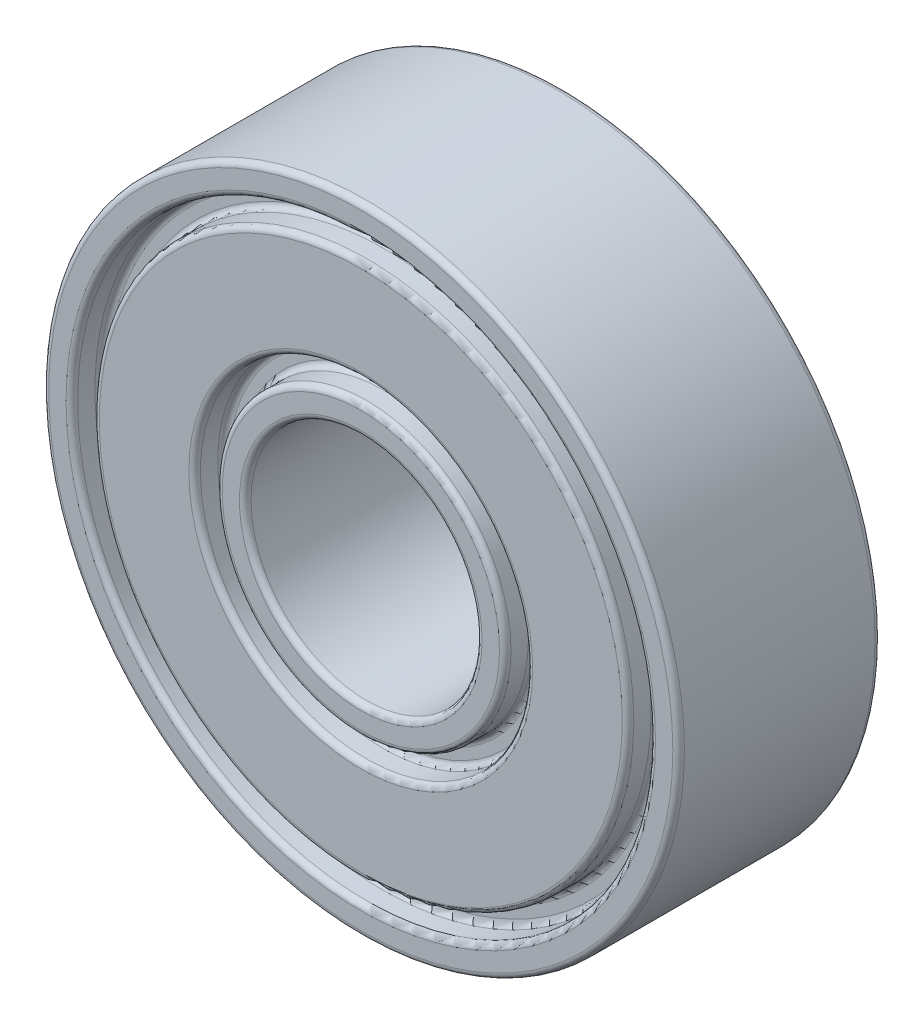
ISO-10303-21;
HEADER;
FILE_DESCRIPTION(('STEP AP214'),'2;1');
FILE_NAME('part.step','',(''),(''),'','','');
FILE_SCHEMA(('AUTOMOTIVE_DESIGN { 1 0 10303 214 1 1 1 1 }'));
ENDSEC;
DATA;
#1=APPLICATION_CONTEXT('core data for automotive mechanical design processes');
#2=APPLICATION_PROTOCOL_DEFINITION('international standard','automotive_design',2000,#1);
#3=PRODUCT_CONTEXT('',#1,'mechanical');
#4=PRODUCT('Part','Part','',(#3));
#5=PRODUCT_RELATED_PRODUCT_CATEGORY('part','',(#4));
#6=PRODUCT_DEFINITION_FORMATION('','',#4);
#7=PRODUCT_DEFINITION_CONTEXT('part definition',#1,'design');
#8=PRODUCT_DEFINITION('design','',#6,#7);
#9=PRODUCT_DEFINITION_SHAPE('','',#8);
#10=(LENGTH_UNIT() NAMED_UNIT(*) SI_UNIT(.MILLI.,.METRE.));
#11=(NAMED_UNIT(*) PLANE_ANGLE_UNIT() SI_UNIT($,.RADIAN.));
#12=(NAMED_UNIT(*) SI_UNIT($,.STERADIAN.) SOLID_ANGLE_UNIT());
#13=UNCERTAINTY_MEASURE_WITH_UNIT(LENGTH_MEASURE(1.E-05),#10,'distance_accuracy_value','');
#14=(GEOMETRIC_REPRESENTATION_CONTEXT(3) GLOBAL_UNCERTAINTY_ASSIGNED_CONTEXT((#13)) GLOBAL_UNIT_ASSIGNED_CONTEXT((#10,
#11,#12)) REPRESENTATION_CONTEXT('',''));
#15=CARTESIAN_POINT('',(0.,0.,0.));
#16=DIRECTION('',(0.,0.,1.));
#17=DIRECTION('',(1.,0.,0.));
#18=AXIS2_PLACEMENT_3D('',#15,#16,#17);
#19=CARTESIAN_POINT('',(0.,0.,7.));
#20=DIRECTION('',(0.,0.,1.));
#21=DIRECTION('',(1.,0.,0.));
#22=AXIS2_PLACEMENT_3D('',#19,#20,#21);
#23=PLANE('',#22);
#24=CARTESIAN_POINT('',(0.,0.,7.));
#25=DIRECTION('',(0.,0.,1.));
#26=DIRECTION('',(1.,0.,0.));
#27=AXIS2_PLACEMENT_3D('',#24,#25,#26);
#28=CIRCLE('',#27,4.8);
#29=CARTESIAN_POINT('',(4.8,0.,7.));
#30=VERTEX_POINT('',#29);
#31=EDGE_CURVE('E157',#30,#30,#28,.T.);
#32=ORIENTED_EDGE('',*,*,#31,.T.);
#33=EDGE_LOOP('',(#32));
#34=FACE_BOUND('',#33,.T.);
#35=CARTESIAN_POINT('',(0.,0.,7.));
#36=DIRECTION('',(0.,0.,1.));
#37=DIRECTION('',(1.,0.,0.));
#38=AXIS2_PLACEMENT_3D('',#35,#36,#37);
#39=CIRCLE('',#38,4.2);
#40=CARTESIAN_POINT('',(4.2,0.,7.));
#41=VERTEX_POINT('',#40);
#42=EDGE_CURVE('E161',#41,#41,#39,.F.);
#43=ORIENTED_EDGE('',*,*,#42,.T.);
#44=EDGE_LOOP('',(#43));
#45=FACE_BOUND('',#44,.T.);
#46=ADVANCED_FACE('F85',(#34,#45),#23,.T.);
#47=CARTESIAN_POINT('',(0.,0.,0.));
#48=DIRECTION('',(0.,0.,1.));
#49=DIRECTION('',(1.,0.,0.));
#50=AXIS2_PLACEMENT_3D('',#47,#48,#49);
#51=PLANE('',#50);
#52=CARTESIAN_POINT('',(0.,0.,0.));
#53=DIRECTION('',(0.,0.,1.));
#54=DIRECTION('',(1.,0.,0.));
#55=AXIS2_PLACEMENT_3D('',#52,#53,#54);
#56=CIRCLE('',#55,4.8);
#57=CARTESIAN_POINT('',(4.8,0.,0.));
#58=VERTEX_POINT('',#57);
#59=EDGE_CURVE('E173',#58,#58,#56,.F.);
#60=ORIENTED_EDGE('',*,*,#59,.T.);
#61=EDGE_LOOP('',(#60));
#62=FACE_BOUND('',#61,.T.);
#63=CARTESIAN_POINT('',(0.,0.,0.));
#64=DIRECTION('',(0.,0.,1.));
#65=DIRECTION('',(1.,0.,0.));
#66=AXIS2_PLACEMENT_3D('',#63,#64,#65);
#67=CIRCLE('',#66,4.2);
#68=CARTESIAN_POINT('',(4.2,0.,0.));
#69=VERTEX_POINT('',#68);
#70=EDGE_CURVE('E177',#69,#69,#67,.T.);
#71=ORIENTED_EDGE('',*,*,#70,.T.);
#72=EDGE_LOOP('',(#71));
#73=FACE_BOUND('',#72,.T.);
#74=ADVANCED_FACE('F322',(#62,#73),#51,.F.);
#75=CARTESIAN_POINT('',(0.,0.,7.));
#76=DIRECTION('',(0.,0.,-1.));
#77=DIRECTION('',(-1.,0.,0.));
#78=AXIS2_PLACEMENT_3D('',#75,#76,#77);
#79=CYLINDRICAL_SURFACE('',#78,11.);
#80=CARTESIAN_POINT('',(0.,0.,0.2));
#81=DIRECTION('',(0.,0.,1.));
#82=DIRECTION('',(1.,0.,0.));
#83=AXIS2_PLACEMENT_3D('',#80,#81,#82);
#84=CIRCLE('',#83,11.);
#85=CARTESIAN_POINT('',(11.,0.,0.2));
#86=VERTEX_POINT('',#85);
#87=EDGE_CURVE('E245',#86,#86,#84,.T.);
#88=ORIENTED_EDGE('',*,*,#87,.T.);
#89=EDGE_LOOP('',(#88));
#90=FACE_BOUND('',#89,.T.);
#91=CARTESIAN_POINT('',(0.,0.,6.8));
#92=DIRECTION('',(0.,0.,1.));
#93=DIRECTION('',(1.,0.,0.));
#94=AXIS2_PLACEMENT_3D('',#91,#92,#93);
#95=CIRCLE('',#94,11.);
#96=CARTESIAN_POINT('',(11.,0.,6.8));
#97=VERTEX_POINT('',#96);
#98=EDGE_CURVE('E249',#97,#97,#95,.F.);
#99=ORIENTED_EDGE('',*,*,#98,.T.);
#100=EDGE_LOOP('',(#99));
#101=FACE_BOUND('',#100,.T.);
#102=ADVANCED_FACE('F254',(#90,#101),#79,.T.);
#103=CARTESIAN_POINT('',(0.,0.,7.));
#104=DIRECTION('',(0.,0.,1.));
#105=DIRECTION('',(1.,0.,0.));
#106=AXIS2_PLACEMENT_3D('',#103,#104,#105);
#107=CIRCLE('',#106,10.8);
#108=CARTESIAN_POINT('',(10.8,0.,7.));
#109=VERTEX_POINT('',#108);
#110=EDGE_CURVE('E141',#109,#109,#107,.T.);
#111=ORIENTED_EDGE('',*,*,#110,.T.);
#112=EDGE_LOOP('',(#111));
#113=FACE_BOUND('',#112,.T.);
#114=CARTESIAN_POINT('',(0.,0.,7.));
#115=DIRECTION('',(0.,0.,1.));
#116=DIRECTION('',(1.,0.,0.));
#117=AXIS2_PLACEMENT_3D('',#114,#115,#116);
#118=CIRCLE('',#117,10.2);
#119=CARTESIAN_POINT('',(10.2,0.,7.));
#120=VERTEX_POINT('',#119);
#121=EDGE_CURVE('E145',#120,#120,#118,.F.);
#122=ORIENTED_EDGE('',*,*,#121,.T.);
#123=EDGE_LOOP('',(#122));
#124=FACE_BOUND('',#123,.T.);
#125=ADVANCED_FACE('F264',(#113,#124),#23,.T.);
#126=CARTESIAN_POINT('',(0.,0.,0.));
#127=DIRECTION('',(0.,0.,1.));
#128=DIRECTION('',(1.,0.,0.));
#129=AXIS2_PLACEMENT_3D('',#126,#127,#128);
#130=CIRCLE('',#129,10.8);
#131=CARTESIAN_POINT('',(10.8,0.,0.));
#132=VERTEX_POINT('',#131);
#133=EDGE_CURVE('E237',#132,#132,#130,.F.);
#134=ORIENTED_EDGE('',*,*,#133,.T.);
#135=EDGE_LOOP('',(#134));
#136=FACE_BOUND('',#135,.T.);
#137=CARTESIAN_POINT('',(0.,0.,0.));
#138=DIRECTION('',(0.,0.,1.));
#139=DIRECTION('',(1.,0.,0.));
#140=AXIS2_PLACEMENT_3D('',#137,#138,#139);
#141=CIRCLE('',#140,10.2);
#142=CARTESIAN_POINT('',(10.2,0.,0.));
#143=VERTEX_POINT('',#142);
#144=EDGE_CURVE('E241',#143,#143,#141,.T.);
#145=ORIENTED_EDGE('',*,*,#144,.T.);
#146=EDGE_LOOP('',(#145));
#147=FACE_BOUND('',#146,.T.);
#148=ADVANCED_FACE('F267',(#136,#147),#51,.F.);
#149=CARTESIAN_POINT('',(0.,0.,7.));
#150=DIRECTION('',(0.,0.,-1.));
#151=DIRECTION('',(-1.,0.,0.));
#152=AXIS2_PLACEMENT_3D('',#149,#150,#151);
#153=CYLINDRICAL_SURFACE('',#152,4.);
#154=CARTESIAN_POINT('',(0.,0.,0.2));
#155=DIRECTION('',(0.,0.,1.));
#156=DIRECTION('',(1.,0.,0.));
#157=AXIS2_PLACEMENT_3D('',#154,#155,#156);
#158=CIRCLE('',#157,4.);
#159=CARTESIAN_POINT('',(4.,0.,0.2));
#160=VERTEX_POINT('',#159);
#161=EDGE_CURVE('E165',#160,#160,#158,.F.);
#162=ORIENTED_EDGE('',*,*,#161,.T.);
#163=EDGE_LOOP('',(#162));
#164=FACE_BOUND('',#163,.T.);
#165=CARTESIAN_POINT('',(0.,0.,6.8));
#166=DIRECTION('',(0.,0.,1.));
#167=DIRECTION('',(1.,0.,0.));
#168=AXIS2_PLACEMENT_3D('',#165,#166,#167);
#169=CIRCLE('',#168,4.);
#170=CARTESIAN_POINT('',(4.,0.,6.8));
#171=VERTEX_POINT('',#170);
#172=EDGE_CURVE('E169',#171,#171,#169,.T.);
#173=ORIENTED_EDGE('',*,*,#172,.T.);
#174=EDGE_LOOP('',(#173));
#175=FACE_BOUND('',#174,.T.);
#176=ADVANCED_FACE('F377',(#164,#175),#153,.F.);
#177=CARTESIAN_POINT('',(0.,0.,1.));
#178=DIRECTION('',(0.,0.,-1.));
#179=DIRECTION('',(-1.,0.,0.));
#180=AXIS2_PLACEMENT_3D('',#177,#178,#179);
#181=CYLINDRICAL_SURFACE('',#180,5.);
#182=CARTESIAN_POINT('',(0.,0.,0.8));
#183=DIRECTION('',(0.,0.,1.));
#184=DIRECTION('',(1.,0.,0.));
#185=AXIS2_PLACEMENT_3D('',#182,#183,#184);
#186=CIRCLE('',#185,5.);
#187=CARTESIAN_POINT('',(5.,0.,0.8));
#188=VERTEX_POINT('',#187);
#189=EDGE_CURVE('E181',#188,#188,#186,.F.);
#190=ORIENTED_EDGE('',*,*,#189,.T.);
#191=EDGE_LOOP('',(#190));
#192=FACE_BOUND('',#191,.T.);
#193=CARTESIAN_POINT('',(0.,0.,0.2));
#194=DIRECTION('',(0.,0.,1.));
#195=DIRECTION('',(1.,0.,0.));
#196=AXIS2_PLACEMENT_3D('',#193,#194,#195);
#197=CIRCLE('',#196,5.);
#198=CARTESIAN_POINT('',(5.,0.,0.2));
#199=VERTEX_POINT('',#198);
#200=EDGE_CURVE('E185',#199,#199,#197,.T.);
#201=ORIENTED_EDGE('',*,*,#200,.T.);
#202=EDGE_LOOP('',(#201));
#203=FACE_BOUND('',#202,.T.);
#204=ADVANCED_FACE('F374',(#192,#203),#181,.T.);
#205=CARTESIAN_POINT('',(0.,0.,1.));
#206=DIRECTION('',(0.,0.,-1.));
#207=DIRECTION('',(-1.,0.,0.));
#208=AXIS2_PLACEMENT_3D('',#205,#206,#207);
#209=CYLINDRICAL_SURFACE('',#208,5.75);
#210=CARTESIAN_POINT('',(0.,0.,0.2));
#211=DIRECTION('',(0.,0.,1.));
#212=DIRECTION('',(1.,0.,0.));
#213=AXIS2_PLACEMENT_3D('',#210,#211,#212);
#214=CIRCLE('',#213,5.75);
#215=CARTESIAN_POINT('',(5.75,0.,0.2));
#216=VERTEX_POINT('',#215);
#217=EDGE_CURVE('E197',#216,#216,#214,.F.);
#218=ORIENTED_EDGE('',*,*,#217,.T.);
#219=EDGE_LOOP('',(#218));
#220=FACE_BOUND('',#219,.T.);
#221=CARTESIAN_POINT('',(0.,0.,0.8));
#222=DIRECTION('',(0.,0.,1.));
#223=DIRECTION('',(1.,0.,0.));
#224=AXIS2_PLACEMENT_3D('',#221,#222,#223);
#225=CIRCLE('',#224,5.75);
#226=CARTESIAN_POINT('',(5.75,0.,0.8));
#227=VERTEX_POINT('',#226);
#228=EDGE_CURVE('E201',#227,#227,#225,.T.);
#229=ORIENTED_EDGE('',*,*,#228,.T.);
#230=EDGE_LOOP('',(#229));
#231=FACE_BOUND('',#230,.T.);
#232=ADVANCED_FACE('F370',(#220,#231),#209,.F.);
#233=CARTESIAN_POINT('',(0.,0.,1.));
#234=DIRECTION('',(0.,0.,1.));
#235=DIRECTION('',(1.,0.,0.));
#236=AXIS2_PLACEMENT_3D('',#233,#234,#235);
#237=PLANE('',#236);
#238=CARTESIAN_POINT('',(0.,0.,1.));
#239=DIRECTION('',(0.,0.,1.));
#240=DIRECTION('',(1.,0.,0.));
#241=AXIS2_PLACEMENT_3D('',#238,#239,#240);
#242=CIRCLE('',#241,5.55);
#243=CARTESIAN_POINT('',(5.55,0.,1.));
#244=VERTEX_POINT('',#243);
#245=EDGE_CURVE('E189',#244,#244,#242,.F.);
#246=ORIENTED_EDGE('',*,*,#245,.T.);
#247=EDGE_LOOP('',(#246));
#248=FACE_BOUND('',#247,.T.);
#249=CARTESIAN_POINT('',(0.,0.,1.));
#250=DIRECTION('',(0.,0.,1.));
#251=DIRECTION('',(1.,0.,0.));
#252=AXIS2_PLACEMENT_3D('',#249,#250,#251);
#253=CIRCLE('',#252,5.2);
#254=CARTESIAN_POINT('',(5.2,0.,1.));
#255=VERTEX_POINT('',#254);
#256=EDGE_CURVE('E193',#255,#255,#253,.T.);
#257=ORIENTED_EDGE('',*,*,#256,.T.);
#258=EDGE_LOOP('',(#257));
#259=FACE_BOUND('',#258,.T.);
#260=ADVANCED_FACE('F366',(#248,#259),#237,.F.);
#261=CARTESIAN_POINT('',(0.,0.,1.));
#262=DIRECTION('',(0.,0.,-1.));
#263=DIRECTION('',(-1.,0.,0.));
#264=AXIS2_PLACEMENT_3D('',#261,#262,#263);
#265=CYLINDRICAL_SURFACE('',#264,9.25);
#266=CARTESIAN_POINT('',(0.,0.,0.8));
#267=DIRECTION('',(0.,0.,1.));
#268=DIRECTION('',(1.,0.,0.));
#269=AXIS2_PLACEMENT_3D('',#266,#267,#268);
#270=CIRCLE('',#269,9.25);
#271=CARTESIAN_POINT('',(9.25,0.,0.8));
#272=VERTEX_POINT('',#271);
#273=EDGE_CURVE('E213',#272,#272,#270,.F.);
#274=ORIENTED_EDGE('',*,*,#273,.T.);
#275=EDGE_LOOP('',(#274));
#276=FACE_BOUND('',#275,.T.);
#277=CARTESIAN_POINT('',(0.,0.,0.2));
#278=DIRECTION('',(0.,0.,1.));
#279=DIRECTION('',(1.,0.,0.));
#280=AXIS2_PLACEMENT_3D('',#277,#278,#279);
#281=CIRCLE('',#280,9.25);
#282=CARTESIAN_POINT('',(9.25,0.,0.2));
#283=VERTEX_POINT('',#282);
#284=EDGE_CURVE('E217',#283,#283,#281,.T.);
#285=ORIENTED_EDGE('',*,*,#284,.T.);
#286=EDGE_LOOP('',(#285));
#287=FACE_BOUND('',#286,.T.);
#288=ADVANCED_FACE('F362',(#276,#287),#265,.T.);
#289=CARTESIAN_POINT('',(0.,0.,1.));
#290=DIRECTION('',(0.,0.,-1.));
#291=DIRECTION('',(-1.,0.,0.));
#292=AXIS2_PLACEMENT_3D('',#289,#290,#291);
#293=CYLINDRICAL_SURFACE('',#292,10.);
#294=CARTESIAN_POINT('',(0.,0.,0.2));
#295=DIRECTION('',(0.,0.,1.));
#296=DIRECTION('',(1.,0.,0.));
#297=AXIS2_PLACEMENT_3D('',#294,#295,#296);
#298=CIRCLE('',#297,10.);
#299=CARTESIAN_POINT('',(10.,0.,0.2));
#300=VERTEX_POINT('',#299);
#301=EDGE_CURVE('E229',#300,#300,#298,.F.);
#302=ORIENTED_EDGE('',*,*,#301,.T.);
#303=EDGE_LOOP('',(#302));
#304=FACE_BOUND('',#303,.T.);
#305=CARTESIAN_POINT('',(0.,0.,0.8));
#306=DIRECTION('',(0.,0.,1.));
#307=DIRECTION('',(1.,0.,0.));
#308=AXIS2_PLACEMENT_3D('',#305,#306,#307);
#309=CIRCLE('',#308,10.);
#310=CARTESIAN_POINT('',(10.,0.,0.8));
#311=VERTEX_POINT('',#310);
#312=EDGE_CURVE('E233',#311,#311,#309,.T.);
#313=ORIENTED_EDGE('',*,*,#312,.T.);
#314=EDGE_LOOP('',(#313));
#315=FACE_BOUND('',#314,.T.);
#316=ADVANCED_FACE('F358',(#304,#315),#293,.F.);
#317=CARTESIAN_POINT('',(0.,0.,1.));
#318=DIRECTION('',(0.,0.,1.));
#319=DIRECTION('',(1.,0.,0.));
#320=AXIS2_PLACEMENT_3D('',#317,#318,#319);
#321=PLANE('',#320);
#322=CARTESIAN_POINT('',(0.,0.,1.));
#323=DIRECTION('',(0.,0.,1.));
#324=DIRECTION('',(1.,0.,0.));
#325=AXIS2_PLACEMENT_3D('',#322,#323,#324);
#326=CIRCLE('',#325,9.8);
#327=CARTESIAN_POINT('',(9.8,0.,1.));
#328=VERTEX_POINT('',#327);
#329=EDGE_CURVE('E221',#328,#328,#326,.F.);
#330=ORIENTED_EDGE('',*,*,#329,.T.);
#331=EDGE_LOOP('',(#330));
#332=FACE_BOUND('',#331,.T.);
#333=CARTESIAN_POINT('',(0.,0.,1.));
#334=DIRECTION('',(0.,0.,1.));
#335=DIRECTION('',(1.,0.,0.));
#336=AXIS2_PLACEMENT_3D('',#333,#334,#335);
#337=CIRCLE('',#336,9.45);
#338=CARTESIAN_POINT('',(9.45,0.,1.));
#339=VERTEX_POINT('',#338);
#340=EDGE_CURVE('E225',#339,#339,#337,.T.);
#341=ORIENTED_EDGE('',*,*,#340,.T.);
#342=EDGE_LOOP('',(#341));
#343=FACE_BOUND('',#342,.T.);
#344=ADVANCED_FACE('F355',(#332,#343),#321,.F.);
#345=CARTESIAN_POINT('',(0.,0.,0.));
#346=DIRECTION('',(0.,0.,1.));
#347=DIRECTION('',(1.,0.,0.));
#348=AXIS2_PLACEMENT_3D('',#345,#346,#347);
#349=CIRCLE('',#348,9.05);
#350=CARTESIAN_POINT('',(9.05,0.,0.));
#351=VERTEX_POINT('',#350);
#352=EDGE_CURVE('E205',#351,#351,#349,.F.);
#353=ORIENTED_EDGE('',*,*,#352,.T.);
#354=EDGE_LOOP('',(#353));
#355=FACE_BOUND('',#354,.T.);
#356=CARTESIAN_POINT('',(0.,0.,0.));
#357=DIRECTION('',(0.,0.,1.));
#358=DIRECTION('',(1.,0.,0.));
#359=AXIS2_PLACEMENT_3D('',#356,#357,#358);
#360=CIRCLE('',#359,5.95);
#361=CARTESIAN_POINT('',(5.95,0.,0.));
#362=VERTEX_POINT('',#361);
#363=EDGE_CURVE('E209',#362,#362,#360,.T.);
#364=ORIENTED_EDGE('',*,*,#363,.T.);
#365=EDGE_LOOP('',(#364));
#366=FACE_BOUND('',#365,.T.);
#367=ADVANCED_FACE('F282',(#355,#366),#51,.F.);
#368=CARTESIAN_POINT('',(0.,0.,6.));
#369=DIRECTION('',(0.,0.,1.));
#370=DIRECTION('',(1.,0.,0.));
#371=AXIS2_PLACEMENT_3D('',#368,#369,#370);
#372=CYLINDRICAL_SURFACE('',#371,10.);
#373=CARTESIAN_POINT('',(0.,0.,6.8));
#374=DIRECTION('',(0.,0.,1.));
#375=DIRECTION('',(1.,0.,0.));
#376=AXIS2_PLACEMENT_3D('',#373,#374,#375);
#377=CIRCLE('',#376,10.);
#378=CARTESIAN_POINT('',(10.,0.,6.8));
#379=VERTEX_POINT('',#378);
#380=EDGE_CURVE('E133',#379,#379,#377,.T.);
#381=ORIENTED_EDGE('',*,*,#380,.T.);
#382=EDGE_LOOP('',(#381));
#383=FACE_BOUND('',#382,.T.);
#384=CARTESIAN_POINT('',(0.,0.,6.2));
#385=DIRECTION('',(0.,0.,1.));
#386=DIRECTION('',(1.,0.,0.));
#387=AXIS2_PLACEMENT_3D('',#384,#385,#386);
#388=CIRCLE('',#387,10.);
#389=CARTESIAN_POINT('',(10.,0.,6.2));
#390=VERTEX_POINT('',#389);
#391=EDGE_CURVE('E137',#390,#390,#388,.F.);
#392=ORIENTED_EDGE('',*,*,#391,.T.);
#393=EDGE_LOOP('',(#392));
#394=FACE_BOUND('',#393,.T.);
#395=ADVANCED_FACE('F278',(#383,#394),#372,.F.);
#396=CARTESIAN_POINT('',(0.,0.,6.));
#397=DIRECTION('',(0.,0.,1.));
#398=DIRECTION('',(1.,0.,0.));
#399=AXIS2_PLACEMENT_3D('',#396,#397,#398);
#400=PLANE('',#399);
#401=CARTESIAN_POINT('',(0.,0.,6.));
#402=DIRECTION('',(0.,0.,1.));
#403=DIRECTION('',(1.,0.,0.));
#404=AXIS2_PLACEMENT_3D('',#401,#402,#403);
#405=CIRCLE('',#404,9.8);
#406=CARTESIAN_POINT('',(9.8,0.,6.));
#407=VERTEX_POINT('',#406);
#408=EDGE_CURVE('E125',#407,#407,#405,.T.);
#409=ORIENTED_EDGE('',*,*,#408,.T.);
#410=EDGE_LOOP('',(#409));
#411=FACE_BOUND('',#410,.T.);
#412=CARTESIAN_POINT('',(0.,0.,6.));
#413=DIRECTION('',(0.,0.,1.));
#414=DIRECTION('',(1.,0.,0.));
#415=AXIS2_PLACEMENT_3D('',#412,#413,#414);
#416=CIRCLE('',#415,9.45);
#417=CARTESIAN_POINT('',(9.45,0.,6.));
#418=VERTEX_POINT('',#417);
#419=EDGE_CURVE('E129',#418,#418,#416,.F.);
#420=ORIENTED_EDGE('',*,*,#419,.T.);
#421=EDGE_LOOP('',(#420));
#422=FACE_BOUND('',#421,.T.);
#423=ADVANCED_FACE('F281',(#411,#422),#400,.T.);
#424=CARTESIAN_POINT('',(0.,0.,6.));
#425=DIRECTION('',(0.,0.,1.));
#426=DIRECTION('',(1.,0.,0.));
#427=AXIS2_PLACEMENT_3D('',#424,#425,#426);
#428=CYLINDRICAL_SURFACE('',#427,9.25);
#429=CARTESIAN_POINT('',(0.,0.,6.2));
#430=DIRECTION('',(0.,0.,1.));
#431=DIRECTION('',(1.,0.,0.));
#432=AXIS2_PLACEMENT_3D('',#429,#430,#431);
#433=CIRCLE('',#432,9.25);
#434=CARTESIAN_POINT('',(9.25,0.,6.2));
#435=VERTEX_POINT('',#434);
#436=EDGE_CURVE('E117',#435,#435,#433,.T.);
#437=ORIENTED_EDGE('',*,*,#436,.T.);
#438=EDGE_LOOP('',(#437));
#439=FACE_BOUND('',#438,.T.);
#440=CARTESIAN_POINT('',(0.,0.,6.8));
#441=DIRECTION('',(0.,0.,1.));
#442=DIRECTION('',(1.,0.,0.));
#443=AXIS2_PLACEMENT_3D('',#440,#441,#442);
#444=CIRCLE('',#443,9.25);
#445=CARTESIAN_POINT('',(9.25,0.,6.8));
#446=VERTEX_POINT('',#445);
#447=EDGE_CURVE('E121',#446,#446,#444,.F.);
#448=ORIENTED_EDGE('',*,*,#447,.T.);
#449=EDGE_LOOP('',(#448));
#450=FACE_BOUND('',#449,.T.);
#451=ADVANCED_FACE('F294',(#439,#450),#428,.T.);
#452=CARTESIAN_POINT('',(0.,0.,6.));
#453=DIRECTION('',(0.,0.,1.));
#454=DIRECTION('',(1.,0.,0.));
#455=AXIS2_PLACEMENT_3D('',#452,#453,#454);
#456=CYLINDRICAL_SURFACE('',#455,5.75);
#457=CARTESIAN_POINT('',(0.,0.,6.2));
#458=DIRECTION('',(0.,0.,1.));
#459=DIRECTION('',(1.,0.,0.));
#460=AXIS2_PLACEMENT_3D('',#457,#458,#459);
#461=CIRCLE('',#460,5.75);
#462=CARTESIAN_POINT('',(5.75,0.,6.2));
#463=VERTEX_POINT('',#462);
#464=EDGE_CURVE('E98',#463,#463,#461,.F.);
#465=ORIENTED_EDGE('',*,*,#464,.T.);
#466=EDGE_LOOP('',(#465));
#467=FACE_BOUND('',#466,.T.);
#468=CARTESIAN_POINT('',(0.,0.,6.8));
#469=DIRECTION('',(0.,0.,1.));
#470=DIRECTION('',(1.,0.,0.));
#471=AXIS2_PLACEMENT_3D('',#468,#469,#470);
#472=CIRCLE('',#471,5.75);
#473=CARTESIAN_POINT('',(5.75,0.,6.8));
#474=VERTEX_POINT('',#473);
#475=EDGE_CURVE('E103',#474,#474,#472,.T.);
#476=ORIENTED_EDGE('',*,*,#475,.T.);
#477=EDGE_LOOP('',(#476));
#478=FACE_BOUND('',#477,.T.);
#479=ADVANCED_FACE('F306',(#467,#478),#456,.F.);
#480=CARTESIAN_POINT('',(0.,0.,6.));
#481=DIRECTION('',(0.,0.,1.));
#482=DIRECTION('',(1.,0.,0.));
#483=AXIS2_PLACEMENT_3D('',#480,#481,#482);
#484=PLANE('',#483);
#485=CARTESIAN_POINT('',(0.,0.,6.));
#486=DIRECTION('',(0.,0.,1.));
#487=DIRECTION('',(1.,0.,0.));
#488=AXIS2_PLACEMENT_3D('',#485,#486,#487);
#489=CIRCLE('',#488,5.55);
#490=CARTESIAN_POINT('',(5.55,0.,6.));
#491=VERTEX_POINT('',#490);
#492=EDGE_CURVE('E109',#491,#491,#489,.T.);
#493=ORIENTED_EDGE('',*,*,#492,.T.);
#494=EDGE_LOOP('',(#493));
#495=FACE_BOUND('',#494,.T.);
#496=CARTESIAN_POINT('',(0.,0.,6.));
#497=DIRECTION('',(0.,0.,1.));
#498=DIRECTION('',(1.,0.,0.));
#499=AXIS2_PLACEMENT_3D('',#496,#497,#498);
#500=CIRCLE('',#499,5.2);
#501=CARTESIAN_POINT('',(5.2,0.,6.));
#502=VERTEX_POINT('',#501);
#503=EDGE_CURVE('E113',#502,#502,#500,.F.);
#504=ORIENTED_EDGE('',*,*,#503,.T.);
#505=EDGE_LOOP('',(#504));
#506=FACE_BOUND('',#505,.T.);
#507=ADVANCED_FACE('F343',(#495,#506),#484,.T.);
#508=CARTESIAN_POINT('',(0.,0.,6.));
#509=DIRECTION('',(0.,0.,1.));
#510=DIRECTION('',(1.,0.,0.));
#511=AXIS2_PLACEMENT_3D('',#508,#509,#510);
#512=CYLINDRICAL_SURFACE('',#511,5.);
#513=CARTESIAN_POINT('',(0.,0.,6.8));
#514=DIRECTION('',(0.,0.,1.));
#515=DIRECTION('',(1.,0.,0.));
#516=AXIS2_PLACEMENT_3D('',#513,#514,#515);
#517=CIRCLE('',#516,5.);
#518=CARTESIAN_POINT('',(5.,0.,6.8));
#519=VERTEX_POINT('',#518);
#520=EDGE_CURVE('E149',#519,#519,#517,.F.);
#521=ORIENTED_EDGE('',*,*,#520,.T.);
#522=EDGE_LOOP('',(#521));
#523=FACE_BOUND('',#522,.T.);
#524=CARTESIAN_POINT('',(0.,0.,6.2));
#525=DIRECTION('',(0.,0.,1.));
#526=DIRECTION('',(1.,0.,0.));
#527=AXIS2_PLACEMENT_3D('',#524,#525,#526);
#528=CIRCLE('',#527,5.);
#529=CARTESIAN_POINT('',(5.,0.,6.2));
#530=VERTEX_POINT('',#529);
#531=EDGE_CURVE('E153',#530,#530,#528,.T.);
#532=ORIENTED_EDGE('',*,*,#531,.T.);
#533=EDGE_LOOP('',(#532));
#534=FACE_BOUND('',#533,.T.);
#535=ADVANCED_FACE('F333',(#523,#534),#512,.T.);
#536=CARTESIAN_POINT('',(0.,0.,7.));
#537=DIRECTION('',(0.,0.,1.));
#538=DIRECTION('',(1.,0.,0.));
#539=AXIS2_PLACEMENT_3D('',#536,#537,#538);
#540=CIRCLE('',#539,9.05);
#541=CARTESIAN_POINT('',(9.05,0.,7.));
#542=VERTEX_POINT('',#541);
#543=EDGE_CURVE('E11',#542,#542,#540,.T.);
#544=ORIENTED_EDGE('',*,*,#543,.T.);
#545=EDGE_LOOP('',(#544));
#546=FACE_BOUND('',#545,.T.);
#547=CARTESIAN_POINT('',(0.,0.,7.));
#548=DIRECTION('',(0.,0.,1.));
#549=DIRECTION('',(1.,0.,0.));
#550=AXIS2_PLACEMENT_3D('',#547,#548,#549);
#551=CIRCLE('',#550,5.95);
#552=CARTESIAN_POINT('',(5.95,0.,7.));
#553=VERTEX_POINT('',#552);
#554=EDGE_CURVE('E93',#553,#553,#551,.F.);
#555=ORIENTED_EDGE('',*,*,#554,.T.);
#556=EDGE_LOOP('',(#555));
#557=FACE_BOUND('',#556,.T.);
#558=ADVANCED_FACE('F269',(#546,#557),#23,.T.);
#559=CARTESIAN_POINT('',(0.,0.,0.2));
#560=DIRECTION('',(0.,0.,1.));
#561=DIRECTION('',(1.,0.,0.));
#562=AXIS2_PLACEMENT_3D('',#559,#560,#561);
#563=TOROIDAL_SURFACE('',#562,10.8,0.2);
#564=ORIENTED_EDGE('',*,*,#133,.F.);
#565=EDGE_LOOP('',(#564));
#566=FACE_BOUND('',#565,.T.);
#567=ORIENTED_EDGE('',*,*,#87,.F.);
#568=EDGE_LOOP('',(#567));
#569=FACE_BOUND('',#568,.T.);
#570=ADVANCED_FACE('F332',(#566,#569),#563,.T.);
#571=CARTESIAN_POINT('',(0.,0.,0.2));
#572=DIRECTION('',(0.,0.,1.));
#573=DIRECTION('',(1.,0.,0.));
#574=AXIS2_PLACEMENT_3D('',#571,#572,#573);
#575=TOROIDAL_SURFACE('',#574,10.2,0.2);
#576=ORIENTED_EDGE('',*,*,#301,.F.);
#577=EDGE_LOOP('',(#576));
#578=FACE_BOUND('',#577,.T.);
#579=ORIENTED_EDGE('',*,*,#144,.F.);
#580=EDGE_LOOP('',(#579));
#581=FACE_BOUND('',#580,.T.);
#582=ADVANCED_FACE('F339',(#578,#581),#575,.T.);
#583=CARTESIAN_POINT('',(0.,0.,0.8));
#584=DIRECTION('',(0.,0.,1.));
#585=DIRECTION('',(1.,0.,0.));
#586=AXIS2_PLACEMENT_3D('',#583,#584,#585);
#587=TOROIDAL_SURFACE('',#586,9.8,0.2);
#588=ORIENTED_EDGE('',*,*,#329,.F.);
#589=EDGE_LOOP('',(#588));
#590=FACE_BOUND('',#589,.T.);
#591=ORIENTED_EDGE('',*,*,#312,.F.);
#592=EDGE_LOOP('',(#591));
#593=FACE_BOUND('',#592,.T.);
#594=ADVANCED_FACE('F545',(#590,#593),#587,.F.);
#595=CARTESIAN_POINT('',(0.,0.,0.8));
#596=DIRECTION('',(0.,0.,1.));
#597=DIRECTION('',(1.,0.,0.));
#598=AXIS2_PLACEMENT_3D('',#595,#596,#597);
#599=TOROIDAL_SURFACE('',#598,9.45,0.2);
#600=ORIENTED_EDGE('',*,*,#273,.F.);
#601=EDGE_LOOP('',(#600));
#602=FACE_BOUND('',#601,.T.);
#603=ORIENTED_EDGE('',*,*,#340,.F.);
#604=EDGE_LOOP('',(#603));
#605=FACE_BOUND('',#604,.T.);
#606=ADVANCED_FACE('F535',(#602,#605),#599,.F.);
#607=CARTESIAN_POINT('',(0.,0.,0.2));
#608=DIRECTION('',(0.,0.,1.));
#609=DIRECTION('',(1.,0.,0.));
#610=AXIS2_PLACEMENT_3D('',#607,#608,#609);
#611=TOROIDAL_SURFACE('',#610,9.05,0.2);
#612=ORIENTED_EDGE('',*,*,#352,.F.);
#613=EDGE_LOOP('',(#612));
#614=FACE_BOUND('',#613,.T.);
#615=ORIENTED_EDGE('',*,*,#284,.F.);
#616=EDGE_LOOP('',(#615));
#617=FACE_BOUND('',#616,.T.);
#618=ADVANCED_FACE('F525',(#614,#617),#611,.T.);
#619=CARTESIAN_POINT('',(0.,0.,0.2));
#620=DIRECTION('',(0.,0.,1.));
#621=DIRECTION('',(1.,0.,0.));
#622=AXIS2_PLACEMENT_3D('',#619,#620,#621);
#623=TOROIDAL_SURFACE('',#622,5.95,0.2);
#624=ORIENTED_EDGE('',*,*,#217,.F.);
#625=EDGE_LOOP('',(#624));
#626=FACE_BOUND('',#625,.T.);
#627=ORIENTED_EDGE('',*,*,#363,.F.);
#628=EDGE_LOOP('',(#627));
#629=FACE_BOUND('',#628,.T.);
#630=ADVANCED_FACE('F515',(#626,#629),#623,.T.);
#631=CARTESIAN_POINT('',(0.,0.,0.8));
#632=DIRECTION('',(0.,0.,1.));
#633=DIRECTION('',(1.,0.,0.));
#634=AXIS2_PLACEMENT_3D('',#631,#632,#633);
#635=TOROIDAL_SURFACE('',#634,5.55,0.2);
#636=ORIENTED_EDGE('',*,*,#245,.F.);
#637=EDGE_LOOP('',(#636));
#638=FACE_BOUND('',#637,.T.);
#639=ORIENTED_EDGE('',*,*,#228,.F.);
#640=EDGE_LOOP('',(#639));
#641=FACE_BOUND('',#640,.T.);
#642=ADVANCED_FACE('F505',(#638,#641),#635,.F.);
#643=CARTESIAN_POINT('',(0.,0.,0.8));
#644=DIRECTION('',(0.,0.,1.));
#645=DIRECTION('',(1.,0.,0.));
#646=AXIS2_PLACEMENT_3D('',#643,#644,#645);
#647=TOROIDAL_SURFACE('',#646,5.2,0.2);
#648=ORIENTED_EDGE('',*,*,#189,.F.);
#649=EDGE_LOOP('',(#648));
#650=FACE_BOUND('',#649,.T.);
#651=ORIENTED_EDGE('',*,*,#256,.F.);
#652=EDGE_LOOP('',(#651));
#653=FACE_BOUND('',#652,.T.);
#654=ADVANCED_FACE('F495',(#650,#653),#647,.F.);
#655=CARTESIAN_POINT('',(0.,0.,0.2));
#656=DIRECTION('',(0.,0.,1.));
#657=DIRECTION('',(1.,0.,0.));
#658=AXIS2_PLACEMENT_3D('',#655,#656,#657);
#659=TOROIDAL_SURFACE('',#658,4.8,0.2);
#660=ORIENTED_EDGE('',*,*,#59,.F.);
#661=EDGE_LOOP('',(#660));
#662=FACE_BOUND('',#661,.T.);
#663=ORIENTED_EDGE('',*,*,#200,.F.);
#664=EDGE_LOOP('',(#663));
#665=FACE_BOUND('',#664,.T.);
#666=ADVANCED_FACE('F486',(#662,#665),#659,.T.);
#667=CARTESIAN_POINT('',(0.,0.,0.2));
#668=DIRECTION('',(0.,0.,1.));
#669=DIRECTION('',(1.,0.,0.));
#670=AXIS2_PLACEMENT_3D('',#667,#668,#669);
#671=TOROIDAL_SURFACE('',#670,4.2,0.2);
#672=ORIENTED_EDGE('',*,*,#161,.F.);
#673=EDGE_LOOP('',(#672));
#674=FACE_BOUND('',#673,.T.);
#675=ORIENTED_EDGE('',*,*,#70,.F.);
#676=EDGE_LOOP('',(#675));
#677=FACE_BOUND('',#676,.T.);
#678=ADVANCED_FACE('F397',(#674,#677),#671,.T.);
#679=CARTESIAN_POINT('',(0.,0.,6.8));
#680=DIRECTION('',(0.,0.,1.));
#681=DIRECTION('',(1.,0.,0.));
#682=AXIS2_PLACEMENT_3D('',#679,#680,#681);
#683=TOROIDAL_SURFACE('',#682,4.8,0.2);
#684=ORIENTED_EDGE('',*,*,#520,.F.);
#685=EDGE_LOOP('',(#684));
#686=FACE_BOUND('',#685,.T.);
#687=ORIENTED_EDGE('',*,*,#31,.F.);
#688=EDGE_LOOP('',(#687));
#689=FACE_BOUND('',#688,.T.);
#690=ADVANCED_FACE('F391',(#686,#689),#683,.T.);
#691=CARTESIAN_POINT('',(0.,0.,6.8));
#692=DIRECTION('',(0.,0.,1.));
#693=DIRECTION('',(1.,0.,0.));
#694=AXIS2_PLACEMENT_3D('',#691,#692,#693);
#695=TOROIDAL_SURFACE('',#694,4.2,0.2);
#696=ORIENTED_EDGE('',*,*,#42,.F.);
#697=EDGE_LOOP('',(#696));
#698=FACE_BOUND('',#697,.T.);
#699=ORIENTED_EDGE('',*,*,#172,.F.);
#700=EDGE_LOOP('',(#699));
#701=FACE_BOUND('',#700,.T.);
#702=ADVANCED_FACE('F260',(#698,#701),#695,.T.);
#703=CARTESIAN_POINT('',(0.,0.,6.8));
#704=DIRECTION('',(0.,0.,1.));
#705=DIRECTION('',(1.,0.,0.));
#706=AXIS2_PLACEMENT_3D('',#703,#704,#705);
#707=TOROIDAL_SURFACE('',#706,10.8,0.2);
#708=ORIENTED_EDGE('',*,*,#98,.F.);
#709=EDGE_LOOP('',(#708));
#710=FACE_BOUND('',#709,.T.);
#711=ORIENTED_EDGE('',*,*,#110,.F.);
#712=EDGE_LOOP('',(#711));
#713=FACE_BOUND('',#712,.T.);
#714=ADVANCED_FACE('F256',(#710,#713),#707,.T.);
#715=CARTESIAN_POINT('',(0.,0.,6.8));
#716=DIRECTION('',(0.,0.,1.));
#717=DIRECTION('',(1.,0.,0.));
#718=AXIS2_PLACEMENT_3D('',#715,#716,#717);
#719=TOROIDAL_SURFACE('',#718,10.2,0.2);
#720=ORIENTED_EDGE('',*,*,#121,.F.);
#721=EDGE_LOOP('',(#720));
#722=FACE_BOUND('',#721,.T.);
#723=ORIENTED_EDGE('',*,*,#380,.F.);
#724=EDGE_LOOP('',(#723));
#725=FACE_BOUND('',#724,.T.);
#726=ADVANCED_FACE('F259',(#722,#725),#719,.T.);
#727=CARTESIAN_POINT('',(0.,0.,6.2));
#728=DIRECTION('',(0.,0.,1.));
#729=DIRECTION('',(1.,0.,0.));
#730=AXIS2_PLACEMENT_3D('',#727,#728,#729);
#731=TOROIDAL_SURFACE('',#730,9.8,0.2);
#732=ORIENTED_EDGE('',*,*,#391,.F.);
#733=EDGE_LOOP('',(#732));
#734=FACE_BOUND('',#733,.T.);
#735=ORIENTED_EDGE('',*,*,#408,.F.);
#736=EDGE_LOOP('',(#735));
#737=FACE_BOUND('',#736,.T.);
#738=ADVANCED_FACE('F274',(#734,#737),#731,.F.);
#739=CARTESIAN_POINT('',(0.,0.,6.2));
#740=DIRECTION('',(0.,0.,1.));
#741=DIRECTION('',(1.,0.,0.));
#742=AXIS2_PLACEMENT_3D('',#739,#740,#741);
#743=TOROIDAL_SURFACE('',#742,9.45,0.2);
#744=ORIENTED_EDGE('',*,*,#419,.F.);
#745=EDGE_LOOP('',(#744));
#746=FACE_BOUND('',#745,.T.);
#747=ORIENTED_EDGE('',*,*,#436,.F.);
#748=EDGE_LOOP('',(#747));
#749=FACE_BOUND('',#748,.T.);
#750=ADVANCED_FACE('F288',(#746,#749),#743,.F.);
#751=CARTESIAN_POINT('',(0.,0.,6.2));
#752=DIRECTION('',(0.,0.,1.));
#753=DIRECTION('',(1.,0.,0.));
#754=AXIS2_PLACEMENT_3D('',#751,#752,#753);
#755=TOROIDAL_SURFACE('',#754,5.55,0.2);
#756=ORIENTED_EDGE('',*,*,#464,.F.);
#757=EDGE_LOOP('',(#756));
#758=FACE_BOUND('',#757,.T.);
#759=ORIENTED_EDGE('',*,*,#492,.F.);
#760=EDGE_LOOP('',(#759));
#761=FACE_BOUND('',#760,.T.);
#762=ADVANCED_FACE('F300',(#758,#761),#755,.F.);
#763=CARTESIAN_POINT('',(0.,0.,6.2));
#764=DIRECTION('',(0.,0.,1.));
#765=DIRECTION('',(1.,0.,0.));
#766=AXIS2_PLACEMENT_3D('',#763,#764,#765);
#767=TOROIDAL_SURFACE('',#766,5.2,0.2);
#768=ORIENTED_EDGE('',*,*,#503,.F.);
#769=EDGE_LOOP('',(#768));
#770=FACE_BOUND('',#769,.T.);
#771=ORIENTED_EDGE('',*,*,#531,.F.);
#772=EDGE_LOOP('',(#771));
#773=FACE_BOUND('',#772,.T.);
#774=ADVANCED_FACE('F313',(#770,#773),#767,.F.);
#775=CARTESIAN_POINT('',(0.,0.,6.8));
#776=DIRECTION('',(0.,0.,1.));
#777=DIRECTION('',(1.,0.,0.));
#778=AXIS2_PLACEMENT_3D('',#775,#776,#777);
#779=TOROIDAL_SURFACE('',#778,9.05,0.2);
#780=ORIENTED_EDGE('',*,*,#447,.F.);
#781=EDGE_LOOP('',(#780));
#782=FACE_BOUND('',#781,.T.);
#783=ORIENTED_EDGE('',*,*,#543,.F.);
#784=EDGE_LOOP('',(#783));
#785=FACE_BOUND('',#784,.T.);
#786=ADVANCED_FACE('F310',(#782,#785),#779,.T.);
#787=CARTESIAN_POINT('',(0.,0.,6.8));
#788=DIRECTION('',(0.,0.,1.));
#789=DIRECTION('',(1.,0.,0.));
#790=AXIS2_PLACEMENT_3D('',#787,#788,#789);
#791=TOROIDAL_SURFACE('',#790,5.95,0.2);
#792=ORIENTED_EDGE('',*,*,#554,.F.);
#793=EDGE_LOOP('',(#792));
#794=FACE_BOUND('',#793,.T.);
#795=ORIENTED_EDGE('',*,*,#475,.F.);
#796=EDGE_LOOP('',(#795));
#797=FACE_BOUND('',#796,.T.);
#798=ADVANCED_FACE('F87',(#794,#797),#791,.T.);
#799=CLOSED_SHELL('',(#46,#74,#102,#125,#148,#176,#204,#232,#260,#288,#316,#344,#367,#395,#423,
#451,#479,#507,#535,#558,#570,#582,#594,#606,#618,#630,#642,#654,#666,#678,#690,#702,#714,#726,
#738,#750,#762,#774,#786,#798));
#800=MANIFOLD_SOLID_BREP('B2',#799);
#801=ADVANCED_BREP_SHAPE_REPRESENTATION('',(#18,#800),#14);
#802=SHAPE_DEFINITION_REPRESENTATION(#9,#801);
ENDSEC;
END-ISO-10303-21;
